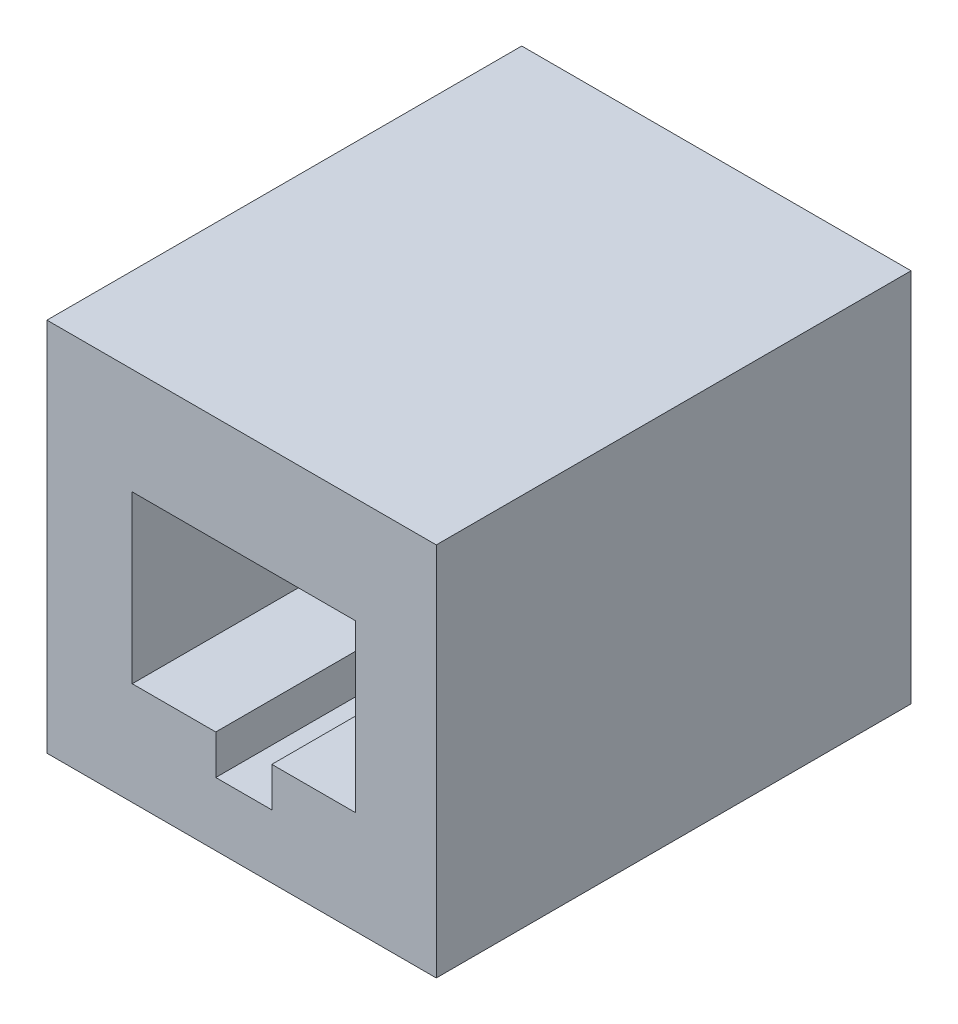
ISO-10303-21;
HEADER;
FILE_DESCRIPTION(('STEP AP214'),'2;1');
FILE_NAME('part.step','',(''),(''),'','','');
FILE_SCHEMA(('AUTOMOTIVE_DESIGN { 1 0 10303 214 1 1 1 1 }'));
ENDSEC;
DATA;
#1=APPLICATION_CONTEXT('core data for automotive mechanical design processes');
#2=APPLICATION_PROTOCOL_DEFINITION('international standard','automotive_design',2000,#1);
#3=PRODUCT_CONTEXT('',#1,'mechanical');
#4=PRODUCT('Part','Part','',(#3));
#5=PRODUCT_RELATED_PRODUCT_CATEGORY('part','',(#4));
#6=PRODUCT_DEFINITION_FORMATION('','',#4);
#7=PRODUCT_DEFINITION_CONTEXT('part definition',#1,'design');
#8=PRODUCT_DEFINITION('design','',#6,#7);
#9=PRODUCT_DEFINITION_SHAPE('','',#8);
#10=(LENGTH_UNIT() NAMED_UNIT(*) SI_UNIT(.MILLI.,.METRE.));
#11=(NAMED_UNIT(*) PLANE_ANGLE_UNIT() SI_UNIT($,.RADIAN.));
#12=(NAMED_UNIT(*) SI_UNIT($,.STERADIAN.) SOLID_ANGLE_UNIT());
#13=UNCERTAINTY_MEASURE_WITH_UNIT(LENGTH_MEASURE(1.E-05),#10,'distance_accuracy_value','');
#14=(GEOMETRIC_REPRESENTATION_CONTEXT(3) GLOBAL_UNCERTAINTY_ASSIGNED_CONTEXT((#13)) GLOBAL_UNIT_ASSIGNED_CONTEXT((#10,
#11,#12)) REPRESENTATION_CONTEXT('',''));
#15=CARTESIAN_POINT('',(0.,0.,0.));
#16=DIRECTION('',(0.,0.,1.));
#17=DIRECTION('',(1.,0.,0.));
#18=AXIS2_PLACEMENT_3D('',#15,#16,#17);
#19=CARTESIAN_POINT('',(0.,0.,0.));
#20=DIRECTION('',(0.,0.,-1.));
#21=DIRECTION('',(-1.,0.,0.));
#22=AXIS2_PLACEMENT_3D('',#19,#20,#21);
#23=PLANE('',#22);
#24=DIRECTION('',(0.,1.,0.));
#25=VECTOR('',#24,1.);
#26=CARTESIAN_POINT('',(0.,0.,0.));
#27=LINE('',#26,#25);
#28=CARTESIAN_POINT('',(0.,0.,0.));
#29=VERTEX_POINT('',#28);
#30=CARTESIAN_POINT('',(0.,20.066,0.));
#31=VERTEX_POINT('',#30);
#32=EDGE_CURVE('E186',#29,#31,#27,.T.);
#33=ORIENTED_EDGE('',*,*,#32,.F.);
#34=DIRECTION('',(1.,0.,0.));
#35=VECTOR('',#34,1.);
#36=CARTESIAN_POINT('',(0.,0.,0.));
#37=LINE('',#36,#35);
#38=CARTESIAN_POINT('',(20.828,0.,0.));
#39=VERTEX_POINT('',#38);
#40=EDGE_CURVE('E190',#29,#39,#37,.T.);
#41=ORIENTED_EDGE('',*,*,#40,.T.);
#42=DIRECTION('',(0.,1.,0.));
#43=VECTOR('',#42,1.);
#44=CARTESIAN_POINT('',(20.828,0.,0.));
#45=LINE('',#44,#43);
#46=CARTESIAN_POINT('',(20.828,20.066,0.));
#47=VERTEX_POINT('',#46);
#48=EDGE_CURVE('E206',#39,#47,#45,.T.);
#49=ORIENTED_EDGE('',*,*,#48,.T.);
#50=DIRECTION('',(1.,0.,0.));
#51=VECTOR('',#50,1.);
#52=CARTESIAN_POINT('',(0.,20.066,0.));
#53=LINE('',#52,#51);
#54=EDGE_CURVE('E202',#31,#47,#53,.T.);
#55=ORIENTED_EDGE('',*,*,#54,.F.);
#56=EDGE_LOOP('',(#33,#41,#49,#55));
#57=FACE_BOUND('',#56,.T.);
#58=DIRECTION('',(0.,1.,0.));
#59=VECTOR('',#58,1.);
#60=CARTESIAN_POINT('',(16.5000000000001,0.,0.));
#61=LINE('',#60,#59);
#62=CARTESIAN_POINT('',(16.5000000000001,5.50000000000005,0.));
#63=VERTEX_POINT('',#62);
#64=CARTESIAN_POINT('',(16.5000000000001,14.39,0.));
#65=VERTEX_POINT('',#64);
#66=EDGE_CURVE('E11',#63,#65,#61,.T.);
#67=ORIENTED_EDGE('',*,*,#66,.F.);
#68=DIRECTION('',(-1.,0.,0.));
#69=VECTOR('',#68,1.);
#70=CARTESIAN_POINT('',(0.,5.50000000000005,0.));
#71=LINE('',#70,#69);
#72=CARTESIAN_POINT('',(12.0310000000001,5.50000000000005,0.));
#73=VERTEX_POINT('',#72);
#74=EDGE_CURVE('E236',#63,#73,#71,.T.);
#75=ORIENTED_EDGE('',*,*,#74,.T.);
#76=DIRECTION('',(0.,1.,0.));
#77=VECTOR('',#76,1.);
#78=CARTESIAN_POINT('',(12.0310000000001,0.,0.));
#79=LINE('',#78,#77);
#80=CARTESIAN_POINT('',(12.0310000000001,3.39000000000005,0.));
#81=VERTEX_POINT('',#80);
#82=EDGE_CURVE('E231',#81,#73,#79,.T.);
#83=ORIENTED_EDGE('',*,*,#82,.F.);
#84=DIRECTION('',(-1.,0.,0.));
#85=VECTOR('',#84,1.);
#86=CARTESIAN_POINT('',(0.,3.39000000000005,0.));
#87=LINE('',#86,#85);
#88=CARTESIAN_POINT('',(9.03099999999996,3.39000000000005,0.));
#89=VERTEX_POINT('',#88);
#90=EDGE_CURVE('E224',#81,#89,#87,.T.);
#91=ORIENTED_EDGE('',*,*,#90,.T.);
#92=DIRECTION('',(0.,1.,0.));
#93=VECTOR('',#92,1.);
#94=CARTESIAN_POINT('',(9.03100000000006,0.,0.));
#95=LINE('',#94,#93);
#96=CARTESIAN_POINT('',(9.03100000000007,5.50000000000005,0.));
#97=VERTEX_POINT('',#96);
#98=EDGE_CURVE('E228',#89,#97,#95,.T.);
#99=ORIENTED_EDGE('',*,*,#98,.T.);
#100=CARTESIAN_POINT('',(4.56200000000006,5.50000000000005,0.));
#101=VERTEX_POINT('',#100);
#102=EDGE_CURVE('E144',#97,#101,#71,.T.);
#103=ORIENTED_EDGE('',*,*,#102,.T.);
#104=DIRECTION('',(0.,1.,0.));
#105=VECTOR('',#104,1.);
#106=CARTESIAN_POINT('',(4.56200000000006,0.,0.));
#107=LINE('',#106,#105);
#108=CARTESIAN_POINT('',(4.56200000000006,14.39,0.));
#109=VERTEX_POINT('',#108);
#110=EDGE_CURVE('E237',#101,#109,#107,.T.);
#111=ORIENTED_EDGE('',*,*,#110,.T.);
#112=DIRECTION('',(-1.,0.,0.));
#113=VECTOR('',#112,1.);
#114=CARTESIAN_POINT('',(0.,14.3900000000001,0.));
#115=LINE('',#114,#113);
#116=EDGE_CURVE('E47',#65,#109,#115,.T.);
#117=ORIENTED_EDGE('',*,*,#116,.F.);
#118=EDGE_LOOP('',(#67,#75,#83,#91,#99,#103,#111,#117));
#119=FACE_BOUND('',#118,.T.);
#120=ADVANCED_FACE('F38',(#57,#119),#23,.F.);
#121=CARTESIAN_POINT('',(0.,0.,-25.4));
#122=DIRECTION('',(1.,0.,0.));
#123=DIRECTION('',(0.,0.,-1.));
#124=AXIS2_PLACEMENT_3D('',#121,#122,#123);
#125=PLANE('',#124);
#126=ORIENTED_EDGE('',*,*,#32,.T.);
#127=DIRECTION('',(0.,0.,1.));
#128=VECTOR('',#127,1.);
#129=CARTESIAN_POINT('',(0.,20.066,-25.4));
#130=LINE('',#129,#128);
#131=CARTESIAN_POINT('',(0.,20.066,-25.4));
#132=VERTEX_POINT('',#131);
#133=EDGE_CURVE('E221',#132,#31,#130,.T.);
#134=ORIENTED_EDGE('',*,*,#133,.F.);
#135=DIRECTION('',(0.,1.,0.));
#136=VECTOR('',#135,1.);
#137=CARTESIAN_POINT('',(0.,0.,-25.4));
#138=LINE('',#137,#136);
#139=CARTESIAN_POINT('',(0.,0.,-25.4));
#140=VERTEX_POINT('',#139);
#141=EDGE_CURVE('E187',#140,#132,#138,.T.);
#142=ORIENTED_EDGE('',*,*,#141,.F.);
#143=DIRECTION('',(0.,0.,1.));
#144=VECTOR('',#143,1.);
#145=CARTESIAN_POINT('',(0.,0.,-25.4));
#146=LINE('',#145,#144);
#147=EDGE_CURVE('E63',#140,#29,#146,.T.);
#148=ORIENTED_EDGE('',*,*,#147,.T.);
#149=EDGE_LOOP('',(#126,#134,#142,#148));
#150=FACE_BOUND('',#149,.T.);
#151=ADVANCED_FACE('F40',(#150),#125,.F.);
#152=CARTESIAN_POINT('',(0.,20.066,-25.4));
#153=DIRECTION('',(0.,-1.,0.));
#154=DIRECTION('',(0.,0.,-1.));
#155=AXIS2_PLACEMENT_3D('',#152,#153,#154);
#156=PLANE('',#155);
#157=ORIENTED_EDGE('',*,*,#54,.T.);
#158=DIRECTION('',(0.,0.,1.));
#159=VECTOR('',#158,1.);
#160=CARTESIAN_POINT('',(20.828,20.066,-25.4));
#161=LINE('',#160,#159);
#162=CARTESIAN_POINT('',(20.828,20.066,-25.4));
#163=VERTEX_POINT('',#162);
#164=EDGE_CURVE('E218',#163,#47,#161,.T.);
#165=ORIENTED_EDGE('',*,*,#164,.F.);
#166=DIRECTION('',(1.,0.,0.));
#167=VECTOR('',#166,1.);
#168=CARTESIAN_POINT('',(0.,20.066,-25.4));
#169=LINE('',#168,#167);
#170=EDGE_CURVE('E90',#132,#163,#169,.T.);
#171=ORIENTED_EDGE('',*,*,#170,.F.);
#172=ORIENTED_EDGE('',*,*,#133,.T.);
#173=EDGE_LOOP('',(#157,#165,#171,#172));
#174=FACE_BOUND('',#173,.T.);
#175=ADVANCED_FACE('F297',(#174),#156,.F.);
#176=CARTESIAN_POINT('',(20.828,0.,-25.4));
#177=DIRECTION('',(1.,0.,0.));
#178=DIRECTION('',(0.,0.,-1.));
#179=AXIS2_PLACEMENT_3D('',#176,#177,#178);
#180=PLANE('',#179);
#181=ORIENTED_EDGE('',*,*,#48,.F.);
#182=DIRECTION('',(0.,0.,1.));
#183=VECTOR('',#182,1.);
#184=CARTESIAN_POINT('',(20.828,0.,-25.4));
#185=LINE('',#184,#183);
#186=CARTESIAN_POINT('',(20.828,0.,-25.4));
#187=VERTEX_POINT('',#186);
#188=EDGE_CURVE('E215',#187,#39,#185,.T.);
#189=ORIENTED_EDGE('',*,*,#188,.F.);
#190=DIRECTION('',(0.,1.,0.));
#191=VECTOR('',#190,1.);
#192=CARTESIAN_POINT('',(20.828,0.,-25.4));
#193=LINE('',#192,#191);
#194=EDGE_CURVE('E193',#187,#163,#193,.T.);
#195=ORIENTED_EDGE('',*,*,#194,.T.);
#196=ORIENTED_EDGE('',*,*,#164,.T.);
#197=EDGE_LOOP('',(#181,#189,#195,#196));
#198=FACE_BOUND('',#197,.T.);
#199=ADVANCED_FACE('F305',(#198),#180,.T.);
#200=CARTESIAN_POINT('',(0.,0.,-25.4));
#201=DIRECTION('',(0.,-1.,0.));
#202=DIRECTION('',(0.,0.,-1.));
#203=AXIS2_PLACEMENT_3D('',#200,#201,#202);
#204=PLANE('',#203);
#205=ORIENTED_EDGE('',*,*,#40,.F.);
#206=ORIENTED_EDGE('',*,*,#147,.F.);
#207=DIRECTION('',(1.,0.,0.));
#208=VECTOR('',#207,1.);
#209=CARTESIAN_POINT('',(0.,0.,-25.4));
#210=LINE('',#209,#208);
#211=EDGE_CURVE('E197',#140,#187,#210,.T.);
#212=ORIENTED_EDGE('',*,*,#211,.T.);
#213=ORIENTED_EDGE('',*,*,#188,.T.);
#214=EDGE_LOOP('',(#205,#206,#212,#213));
#215=FACE_BOUND('',#214,.T.);
#216=ADVANCED_FACE('F302',(#215),#204,.T.);
#217=CARTESIAN_POINT('',(0.,0.,-25.4));
#218=DIRECTION('',(0.,0.,-1.));
#219=DIRECTION('',(-1.,0.,0.));
#220=AXIS2_PLACEMENT_3D('',#217,#218,#219);
#221=PLANE('',#220);
#222=ORIENTED_EDGE('',*,*,#141,.T.);
#223=ORIENTED_EDGE('',*,*,#170,.T.);
#224=ORIENTED_EDGE('',*,*,#194,.F.);
#225=ORIENTED_EDGE('',*,*,#211,.F.);
#226=EDGE_LOOP('',(#222,#223,#224,#225));
#227=FACE_BOUND('',#226,.T.);
#228=ADVANCED_FACE('F300',(#227),#221,.T.);
#229=CARTESIAN_POINT('',(16.5000000000001,5.50000000000008,10.4999999999984));
#230=DIRECTION('',(-1.,0.,0.));
#231=DIRECTION('',(0.,0.,1.));
#232=AXIS2_PLACEMENT_3D('',#229,#230,#231);
#233=PLANE('',#232);
#234=ORIENTED_EDGE('',*,*,#66,.T.);
#235=DIRECTION('',(0.,0.,-1.));
#236=VECTOR('',#235,1.);
#237=CARTESIAN_POINT('',(16.5000000000001,14.3900000000001,10.4999999999984));
#238=LINE('',#237,#236);
#239=CARTESIAN_POINT('',(16.5,14.39,-14.9000000000016));
#240=VERTEX_POINT('',#239);
#241=EDGE_CURVE('E183',#65,#240,#238,.T.);
#242=ORIENTED_EDGE('',*,*,#241,.T.);
#243=DIRECTION('',(0.,1.,0.));
#244=VECTOR('',#243,1.);
#245=CARTESIAN_POINT('',(16.5,5.5,-14.9000000000016));
#246=LINE('',#245,#244);
#247=CARTESIAN_POINT('',(16.5,5.5,-14.9000000000016));
#248=VERTEX_POINT('',#247);
#249=EDGE_CURVE('E270',#248,#240,#246,.T.);
#250=ORIENTED_EDGE('',*,*,#249,.F.);
#251=DIRECTION('',(0.,0.,-1.));
#252=VECTOR('',#251,1.);
#253=CARTESIAN_POINT('',(16.5000000000001,5.50000000000008,10.4999999999984));
#254=LINE('',#253,#252);
#255=EDGE_CURVE('E170',#63,#248,#254,.T.);
#256=ORIENTED_EDGE('',*,*,#255,.F.);
#257=EDGE_LOOP('',(#234,#242,#250,#256));
#258=FACE_BOUND('',#257,.T.);
#259=ADVANCED_FACE('F277',(#258),#233,.T.);
#260=CARTESIAN_POINT('',(16.5000000000001,14.3900000000001,10.4999999999984));
#261=DIRECTION('',(0.,-1.,0.));
#262=DIRECTION('',(0.,0.,1.));
#263=AXIS2_PLACEMENT_3D('',#260,#261,#262);
#264=PLANE('',#263);
#265=ORIENTED_EDGE('',*,*,#116,.T.);
#266=DIRECTION('',(0.,0.,-1.));
#267=VECTOR('',#266,1.);
#268=CARTESIAN_POINT('',(4.56200000000014,14.3900000000001,10.4999999999985));
#269=LINE('',#268,#267);
#270=CARTESIAN_POINT('',(4.56199999999996,14.39,-14.9000000000015));
#271=VERTEX_POINT('',#270);
#272=EDGE_CURVE('E180',#109,#271,#269,.T.);
#273=ORIENTED_EDGE('',*,*,#272,.T.);
#274=DIRECTION('',(-1.,0.,0.));
#275=VECTOR('',#274,1.);
#276=CARTESIAN_POINT('',(16.5,14.39,-14.9000000000016));
#277=LINE('',#276,#275);
#278=EDGE_CURVE('E171',#240,#271,#277,.T.);
#279=ORIENTED_EDGE('',*,*,#278,.F.);
#280=ORIENTED_EDGE('',*,*,#241,.F.);
#281=EDGE_LOOP('',(#265,#273,#279,#280));
#282=FACE_BOUND('',#281,.T.);
#283=ADVANCED_FACE('F245',(#282),#264,.T.);
#284=CARTESIAN_POINT('',(4.56200000000014,5.50000000000008,10.4999999999985));
#285=DIRECTION('',(-1.,0.,0.));
#286=DIRECTION('',(0.,0.,1.));
#287=AXIS2_PLACEMENT_3D('',#284,#285,#286);
#288=PLANE('',#287);
#289=DIRECTION('',(0.,0.,-1.));
#290=VECTOR('',#289,1.);
#291=CARTESIAN_POINT('',(4.56200000000014,5.50000000000008,10.4999999999985));
#292=LINE('',#291,#290);
#293=CARTESIAN_POINT('',(4.56199999999996,5.5,-14.9000000000015));
#294=VERTEX_POINT('',#293);
#295=EDGE_CURVE('E177',#101,#294,#292,.T.);
#296=ORIENTED_EDGE('',*,*,#295,.T.);
#297=DIRECTION('',(0.,1.,0.));
#298=VECTOR('',#297,1.);
#299=CARTESIAN_POINT('',(4.56199999999996,5.5,-14.9000000000015));
#300=LINE('',#299,#298);
#301=EDGE_CURVE('E163',#294,#271,#300,.T.);
#302=ORIENTED_EDGE('',*,*,#301,.T.);
#303=ORIENTED_EDGE('',*,*,#272,.F.);
#304=ORIENTED_EDGE('',*,*,#110,.F.);
#305=EDGE_LOOP('',(#296,#302,#303,#304));
#306=FACE_BOUND('',#305,.T.);
#307=ADVANCED_FACE('F250',(#306),#288,.F.);
#308=CARTESIAN_POINT('',(16.5000000000001,5.50000000000008,10.4999999999984));
#309=DIRECTION('',(0.,-1.,0.));
#310=DIRECTION('',(0.,0.,1.));
#311=AXIS2_PLACEMENT_3D('',#308,#309,#310);
#312=PLANE('',#311);
#313=ORIENTED_EDGE('',*,*,#255,.T.);
#314=DIRECTION('',(-1.,0.,0.));
#315=VECTOR('',#314,1.);
#316=CARTESIAN_POINT('',(16.5,5.5,-14.9000000000016));
#317=LINE('',#316,#315);
#318=CARTESIAN_POINT('',(12.031,5.5,-14.9000000000016));
#319=VERTEX_POINT('',#318);
#320=EDGE_CURVE('E165',#248,#319,#317,.T.);
#321=ORIENTED_EDGE('',*,*,#320,.T.);
#322=DIRECTION('',(0.,0.,-1.));
#323=VECTOR('',#322,1.);
#324=CARTESIAN_POINT('',(12.0310000000001,5.50000000000005,0.0999999999984381));
#325=LINE('',#324,#323);
#326=EDGE_CURVE('E148',#73,#319,#325,.T.);
#327=ORIENTED_EDGE('',*,*,#326,.F.);
#328=ORIENTED_EDGE('',*,*,#74,.F.);
#329=EDGE_LOOP('',(#313,#321,#327,#328));
#330=FACE_BOUND('',#329,.T.);
#331=ADVANCED_FACE('F282',(#330),#312,.F.);
#332=DIRECTION('',(0.,0.,-1.));
#333=VECTOR('',#332,1.);
#334=CARTESIAN_POINT('',(9.03100000000007,5.50000000000005,0.099999999998459));
#335=LINE('',#334,#333);
#336=CARTESIAN_POINT('',(9.03099999999996,5.5,-14.9000000000015));
#337=VERTEX_POINT('',#336);
#338=EDGE_CURVE('E136',#97,#337,#335,.T.);
#339=ORIENTED_EDGE('',*,*,#338,.T.);
#340=EDGE_CURVE('E141',#337,#294,#317,.T.);
#341=ORIENTED_EDGE('',*,*,#340,.T.);
#342=ORIENTED_EDGE('',*,*,#295,.F.);
#343=ORIENTED_EDGE('',*,*,#102,.F.);
#344=EDGE_LOOP('',(#339,#341,#342,#343));
#345=FACE_BOUND('',#344,.T.);
#346=ADVANCED_FACE('F138',(#345),#312,.F.);
#347=CARTESIAN_POINT('',(12.0310000000001,3.39000000000005,0.0999999999984451));
#348=DIRECTION('',(-1.,0.,0.));
#349=DIRECTION('',(0.,0.,1.));
#350=AXIS2_PLACEMENT_3D('',#347,#348,#349);
#351=PLANE('',#350);
#352=ORIENTED_EDGE('',*,*,#82,.T.);
#353=ORIENTED_EDGE('',*,*,#326,.T.);
#354=DIRECTION('',(0.,1.,0.));
#355=VECTOR('',#354,1.);
#356=CARTESIAN_POINT('',(12.031,3.39,-14.9000000000016));
#357=LINE('',#356,#355);
#358=CARTESIAN_POINT('',(12.031,3.39,-14.9000000000016));
#359=VERTEX_POINT('',#358);
#360=EDGE_CURVE('E157',#359,#319,#357,.T.);
#361=ORIENTED_EDGE('',*,*,#360,.F.);
#362=DIRECTION('',(0.,0.,-1.));
#363=VECTOR('',#362,1.);
#364=CARTESIAN_POINT('',(12.0310000000001,3.39000000000005,0.0999999999984451));
#365=LINE('',#364,#363);
#366=EDGE_CURVE('E255',#81,#359,#365,.T.);
#367=ORIENTED_EDGE('',*,*,#366,.F.);
#368=EDGE_LOOP('',(#352,#353,#361,#367));
#369=FACE_BOUND('',#368,.T.);
#370=ADVANCED_FACE('F258',(#369),#351,.T.);
#371=CARTESIAN_POINT('',(9.03100000000006,3.39000000000005,0.0999999999984659));
#372=DIRECTION('',(-1.,0.,0.));
#373=DIRECTION('',(0.,1.,0.));
#374=AXIS2_PLACEMENT_3D('',#371,#372,#373);
#375=PLANE('',#374);
#376=DIRECTION('',(0.,0.,-1.));
#377=VECTOR('',#376,1.);
#378=CARTESIAN_POINT('',(9.03100000000006,3.39000000000005,0.0999999999984659));
#379=LINE('',#378,#377);
#380=CARTESIAN_POINT('',(9.03099999999996,3.39,-14.9000000000015));
#381=VERTEX_POINT('',#380);
#382=EDGE_CURVE('E54',#89,#381,#379,.T.);
#383=ORIENTED_EDGE('',*,*,#382,.T.);
#384=DIRECTION('',(0.,1.,0.));
#385=VECTOR('',#384,1.);
#386=CARTESIAN_POINT('',(9.03099999999996,3.39,-14.9000000000015));
#387=LINE('',#386,#385);
#388=EDGE_CURVE('E151',#381,#337,#387,.T.);
#389=ORIENTED_EDGE('',*,*,#388,.T.);
#390=ORIENTED_EDGE('',*,*,#338,.F.);
#391=ORIENTED_EDGE('',*,*,#98,.F.);
#392=EDGE_LOOP('',(#383,#389,#390,#391));
#393=FACE_BOUND('',#392,.T.);
#394=ADVANCED_FACE('F152',(#393),#375,.F.);
#395=CARTESIAN_POINT('',(12.0310000000001,3.39000000000005,0.0999999999984451));
#396=DIRECTION('',(0.,-1.,0.));
#397=DIRECTION('',(-1.,0.,0.));
#398=AXIS2_PLACEMENT_3D('',#395,#396,#397);
#399=PLANE('',#398);
#400=ORIENTED_EDGE('',*,*,#366,.T.);
#401=DIRECTION('',(-1.,0.,0.));
#402=VECTOR('',#401,1.);
#403=CARTESIAN_POINT('',(12.031,3.39,-14.9000000000016));
#404=LINE('',#403,#402);
#405=EDGE_CURVE('E156',#359,#381,#404,.T.);
#406=ORIENTED_EDGE('',*,*,#405,.T.);
#407=ORIENTED_EDGE('',*,*,#382,.F.);
#408=ORIENTED_EDGE('',*,*,#90,.F.);
#409=EDGE_LOOP('',(#400,#406,#407,#408));
#410=FACE_BOUND('',#409,.T.);
#411=ADVANCED_FACE('F254',(#410),#399,.F.);
#412=CARTESIAN_POINT('',(16.5,5.5,-14.9000000000016));
#413=DIRECTION('',(0.,0.,1.));
#414=DIRECTION('',(1.,0.,0.));
#415=AXIS2_PLACEMENT_3D('',#412,#413,#414);
#416=PLANE('',#415);
#417=ORIENTED_EDGE('',*,*,#249,.T.);
#418=ORIENTED_EDGE('',*,*,#278,.T.);
#419=ORIENTED_EDGE('',*,*,#301,.F.);
#420=ORIENTED_EDGE('',*,*,#340,.F.);
#421=ORIENTED_EDGE('',*,*,#388,.F.);
#422=ORIENTED_EDGE('',*,*,#405,.F.);
#423=ORIENTED_EDGE('',*,*,#360,.T.);
#424=ORIENTED_EDGE('',*,*,#320,.F.);
#425=EDGE_LOOP('',(#417,#418,#419,#420,#421,#422,#423,#424));
#426=FACE_BOUND('',#425,.T.);
#427=ADVANCED_FACE('F160',(#426),#416,.T.);
#428=CLOSED_SHELL('',(#120,#151,#175,#199,#216,#228,#259,#283,#307,#331,#346,#370,#394,#411,#427));
#429=MANIFOLD_SOLID_BREP('B2',#428);
#430=ADVANCED_BREP_SHAPE_REPRESENTATION('',(#18,#429),#14);
#431=SHAPE_DEFINITION_REPRESENTATION(#9,#430);
ENDSEC;
END-ISO-10303-21;
